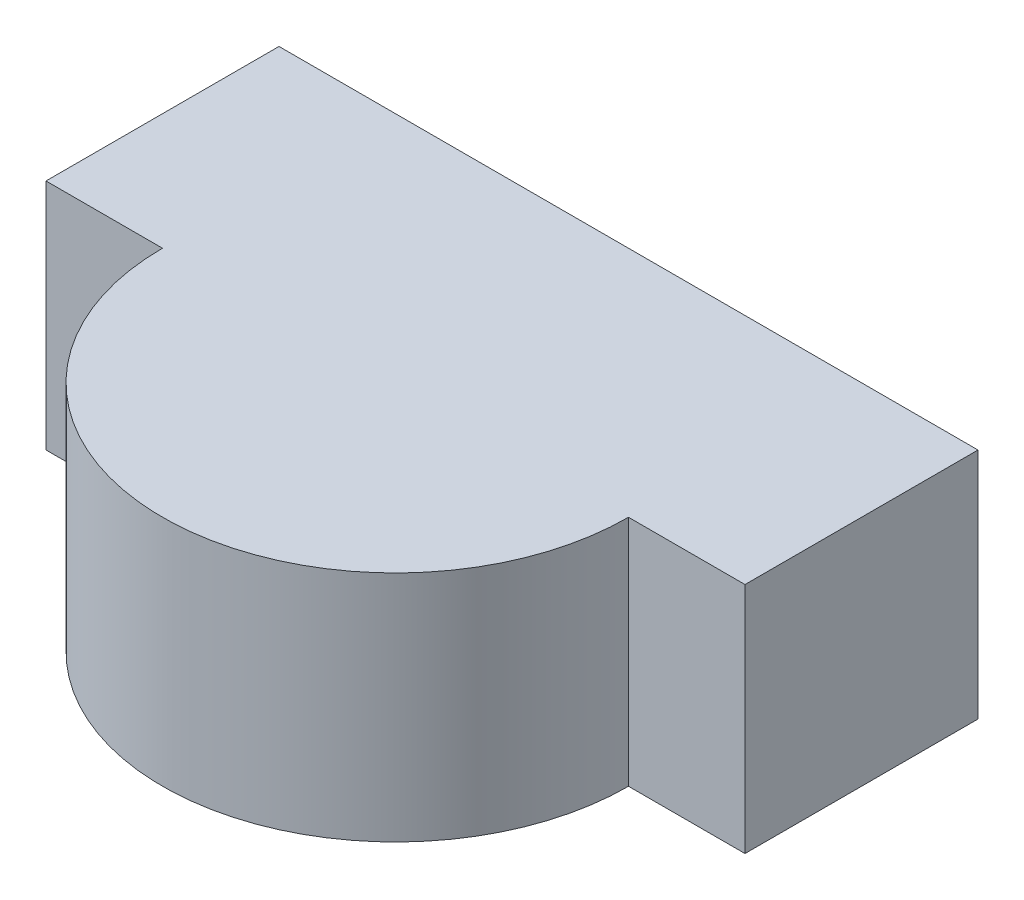
ISO-10303-21;
HEADER;
FILE_DESCRIPTION(('STEP AP214'),'2;1');
FILE_NAME('part.step','',(''),(''),'','','');
FILE_SCHEMA(('AUTOMOTIVE_DESIGN { 1 0 10303 214 1 1 1 1 }'));
ENDSEC;
DATA;
#1=APPLICATION_CONTEXT('core data for automotive mechanical design processes');
#2=APPLICATION_PROTOCOL_DEFINITION('international standard','automotive_design',2000,#1);
#3=PRODUCT_CONTEXT('',#1,'mechanical');
#4=PRODUCT('Part','Part','',(#3));
#5=PRODUCT_RELATED_PRODUCT_CATEGORY('part','',(#4));
#6=PRODUCT_DEFINITION_FORMATION('','',#4);
#7=PRODUCT_DEFINITION_CONTEXT('part definition',#1,'design');
#8=PRODUCT_DEFINITION('design','',#6,#7);
#9=PRODUCT_DEFINITION_SHAPE('','',#8);
#10=(LENGTH_UNIT() NAMED_UNIT(*) SI_UNIT(.MILLI.,.METRE.));
#11=(NAMED_UNIT(*) PLANE_ANGLE_UNIT() SI_UNIT($,.RADIAN.));
#12=(NAMED_UNIT(*) SI_UNIT($,.STERADIAN.) SOLID_ANGLE_UNIT());
#13=UNCERTAINTY_MEASURE_WITH_UNIT(LENGTH_MEASURE(1.E-05),#10,'distance_accuracy_value','');
#14=(GEOMETRIC_REPRESENTATION_CONTEXT(3) GLOBAL_UNCERTAINTY_ASSIGNED_CONTEXT((#13)) GLOBAL_UNIT_ASSIGNED_CONTEXT((#10,
#11,#12)) REPRESENTATION_CONTEXT('',''));
#15=CARTESIAN_POINT('',(0.,0.,0.));
#16=DIRECTION('',(0.,0.,1.));
#17=DIRECTION('',(1.,0.,0.));
#18=AXIS2_PLACEMENT_3D('',#15,#16,#17);
#19=CARTESIAN_POINT('',(1.5,1.,-0.500000000000001));
#20=DIRECTION('',(-1.,0.,0.));
#21=DIRECTION('',(0.,0.,1.));
#22=AXIS2_PLACEMENT_3D('',#19,#20,#21);
#23=PLANE('',#22);
#24=DIRECTION('',(0.,0.,-1.));
#25=VECTOR('',#24,1.);
#26=CARTESIAN_POINT('',(1.5,0.,-0.500000000000001));
#27=LINE('',#26,#25);
#28=CARTESIAN_POINT('',(1.5,0.,0.499999999999999));
#29=VERTEX_POINT('',#28);
#30=CARTESIAN_POINT('',(1.5,0.,-0.500000000000001));
#31=VERTEX_POINT('',#30);
#32=EDGE_CURVE('E116',#29,#31,#27,.T.);
#33=ORIENTED_EDGE('',*,*,#32,.T.);
#34=DIRECTION('',(0.,-1.,0.));
#35=VECTOR('',#34,1.);
#36=CARTESIAN_POINT('',(1.5,1.,-0.500000000000001));
#37=LINE('',#36,#35);
#38=CARTESIAN_POINT('',(1.5,1.,-0.500000000000001));
#39=VERTEX_POINT('',#38);
#40=EDGE_CURVE('E11',#39,#31,#37,.T.);
#41=ORIENTED_EDGE('',*,*,#40,.F.);
#42=DIRECTION('',(0.,0.,-1.));
#43=VECTOR('',#42,1.);
#44=CARTESIAN_POINT('',(1.5,1.,-0.500000000000001));
#45=LINE('',#44,#43);
#46=CARTESIAN_POINT('',(1.5,1.,0.499999999999999));
#47=VERTEX_POINT('',#46);
#48=EDGE_CURVE('E126',#47,#39,#45,.T.);
#49=ORIENTED_EDGE('',*,*,#48,.F.);
#50=DIRECTION('',(0.,-1.,0.));
#51=VECTOR('',#50,1.);
#52=CARTESIAN_POINT('',(1.5,1.,0.499999999999999));
#53=LINE('',#52,#51);
#54=EDGE_CURVE('E112',#47,#29,#53,.T.);
#55=ORIENTED_EDGE('',*,*,#54,.T.);
#56=EDGE_LOOP('',(#33,#41,#49,#55));
#57=FACE_BOUND('',#56,.T.);
#58=ADVANCED_FACE('F32',(#57),#23,.F.);
#59=CARTESIAN_POINT('',(-1.5,1.,-0.500000000000001));
#60=DIRECTION('',(0.,0.,1.));
#61=DIRECTION('',(1.,0.,0.));
#62=AXIS2_PLACEMENT_3D('',#59,#60,#61);
#63=PLANE('',#62);
#64=DIRECTION('',(-1.,0.,0.));
#65=VECTOR('',#64,1.);
#66=CARTESIAN_POINT('',(-1.5,0.,-0.500000000000001));
#67=LINE('',#66,#65);
#68=CARTESIAN_POINT('',(-1.5,0.,-0.500000000000001));
#69=VERTEX_POINT('',#68);
#70=EDGE_CURVE('E119',#31,#69,#67,.T.);
#71=ORIENTED_EDGE('',*,*,#70,.T.);
#72=DIRECTION('',(0.,-1.,0.));
#73=VECTOR('',#72,1.);
#74=CARTESIAN_POINT('',(-1.5,1.,-0.500000000000001));
#75=LINE('',#74,#73);
#76=CARTESIAN_POINT('',(-1.5,1.,-0.500000000000001));
#77=VERTEX_POINT('',#76);
#78=EDGE_CURVE('E40',#77,#69,#75,.T.);
#79=ORIENTED_EDGE('',*,*,#78,.F.);
#80=DIRECTION('',(-1.,0.,0.));
#81=VECTOR('',#80,1.);
#82=CARTESIAN_POINT('',(-1.5,1.,-0.500000000000001));
#83=LINE('',#82,#81);
#84=EDGE_CURVE('E85',#39,#77,#83,.T.);
#85=ORIENTED_EDGE('',*,*,#84,.F.);
#86=ORIENTED_EDGE('',*,*,#40,.T.);
#87=EDGE_LOOP('',(#71,#79,#85,#86));
#88=FACE_BOUND('',#87,.T.);
#89=ADVANCED_FACE('F151',(#88),#63,.F.);
#90=CARTESIAN_POINT('',(-1.5,1.,-0.500000000000001));
#91=DIRECTION('',(1.,0.,0.));
#92=DIRECTION('',(0.,0.,-1.));
#93=AXIS2_PLACEMENT_3D('',#90,#91,#92);
#94=PLANE('',#93);
#95=DIRECTION('',(0.,0.,1.));
#96=VECTOR('',#95,1.);
#97=CARTESIAN_POINT('',(-1.5,0.,-0.500000000000001));
#98=LINE('',#97,#96);
#99=CARTESIAN_POINT('',(-1.5,0.,0.499999999999999));
#100=VERTEX_POINT('',#99);
#101=EDGE_CURVE('E121',#69,#100,#98,.T.);
#102=ORIENTED_EDGE('',*,*,#101,.T.);
#103=DIRECTION('',(0.,-1.,0.));
#104=VECTOR('',#103,1.);
#105=CARTESIAN_POINT('',(-1.5,1.,0.499999999999999));
#106=LINE('',#105,#104);
#107=CARTESIAN_POINT('',(-1.5,1.,0.499999999999999));
#108=VERTEX_POINT('',#107);
#109=EDGE_CURVE('E107',#108,#100,#106,.T.);
#110=ORIENTED_EDGE('',*,*,#109,.F.);
#111=DIRECTION('',(0.,0.,1.));
#112=VECTOR('',#111,1.);
#113=CARTESIAN_POINT('',(-1.5,1.,-0.500000000000001));
#114=LINE('',#113,#112);
#115=EDGE_CURVE('E98',#77,#108,#114,.T.);
#116=ORIENTED_EDGE('',*,*,#115,.F.);
#117=ORIENTED_EDGE('',*,*,#78,.T.);
#118=EDGE_LOOP('',(#102,#110,#116,#117));
#119=FACE_BOUND('',#118,.T.);
#120=ADVANCED_FACE('F132',(#119),#94,.F.);
#121=CARTESIAN_POINT('',(-1.5,1.,0.499999999999999));
#122=DIRECTION('',(0.,0.,-1.));
#123=DIRECTION('',(-1.,0.,0.));
#124=AXIS2_PLACEMENT_3D('',#121,#122,#123);
#125=PLANE('',#124);
#126=DIRECTION('',(1.,0.,0.));
#127=VECTOR('',#126,1.);
#128=CARTESIAN_POINT('',(-1.5,0.,0.499999999999999));
#129=LINE('',#128,#127);
#130=CARTESIAN_POINT('',(-0.999999999999996,0.,0.499999999999999));
#131=VERTEX_POINT('',#130);
#132=EDGE_CURVE('E106',#100,#131,#129,.T.);
#133=ORIENTED_EDGE('',*,*,#132,.T.);
#134=DIRECTION('',(0.,-1.,0.));
#135=VECTOR('',#134,1.);
#136=CARTESIAN_POINT('',(-0.999999999999996,1.,0.499999999999999));
#137=LINE('',#136,#135);
#138=CARTESIAN_POINT('',(-0.999999999999996,1.,0.499999999999999));
#139=VERTEX_POINT('',#138);
#140=EDGE_CURVE('E103',#139,#131,#137,.T.);
#141=ORIENTED_EDGE('',*,*,#140,.F.);
#142=DIRECTION('',(1.,0.,0.));
#143=VECTOR('',#142,1.);
#144=CARTESIAN_POINT('',(-1.5,1.,0.499999999999999));
#145=LINE('',#144,#143);
#146=EDGE_CURVE('E92',#108,#139,#145,.T.);
#147=ORIENTED_EDGE('',*,*,#146,.F.);
#148=ORIENTED_EDGE('',*,*,#109,.T.);
#149=EDGE_LOOP('',(#133,#141,#147,#148));
#150=FACE_BOUND('',#149,.T.);
#151=ADVANCED_FACE('F104',(#150),#125,.F.);
#152=CARTESIAN_POINT('',(0.,1.,0.499999999999999));
#153=DIRECTION('',(0.,-1.,0.));
#154=DIRECTION('',(0.,0.,-1.));
#155=AXIS2_PLACEMENT_3D('',#152,#153,#154);
#156=CYLINDRICAL_SURFACE('',#155,1.);
#157=CARTESIAN_POINT('',(0.,0.,0.499999999999999));
#158=DIRECTION('',(0.,1.,0.));
#159=DIRECTION('',(0.,0.,1.));
#160=AXIS2_PLACEMENT_3D('',#157,#158,#159);
#161=CIRCLE('',#160,1.);
#162=CARTESIAN_POINT('',(1.,0.,0.499999999999999));
#163=VERTEX_POINT('',#162);
#164=EDGE_CURVE('E71',#131,#163,#161,.T.);
#165=ORIENTED_EDGE('',*,*,#164,.T.);
#166=DIRECTION('',(0.,-1.,0.));
#167=VECTOR('',#166,1.);
#168=CARTESIAN_POINT('',(1.,1.,0.499999999999999));
#169=LINE('',#168,#167);
#170=CARTESIAN_POINT('',(1.,1.,0.499999999999999));
#171=VERTEX_POINT('',#170);
#172=EDGE_CURVE('E108',#171,#163,#169,.T.);
#173=ORIENTED_EDGE('',*,*,#172,.F.);
#174=CARTESIAN_POINT('',(0.,1.,0.499999999999999));
#175=DIRECTION('',(0.,1.,0.));
#176=DIRECTION('',(0.,0.,1.));
#177=AXIS2_PLACEMENT_3D('',#174,#175,#176);
#178=CIRCLE('',#177,1.);
#179=EDGE_CURVE('E96',#139,#171,#178,.T.);
#180=ORIENTED_EDGE('',*,*,#179,.F.);
#181=ORIENTED_EDGE('',*,*,#140,.T.);
#182=EDGE_LOOP('',(#165,#173,#180,#181));
#183=FACE_BOUND('',#182,.T.);
#184=ADVANCED_FACE('F110',(#183),#156,.T.);
#185=CARTESIAN_POINT('',(1.,1.,0.499999999999999));
#186=DIRECTION('',(0.,0.,-1.));
#187=DIRECTION('',(-1.,0.,0.));
#188=AXIS2_PLACEMENT_3D('',#185,#186,#187);
#189=PLANE('',#188);
#190=DIRECTION('',(1.,0.,0.));
#191=VECTOR('',#190,1.);
#192=CARTESIAN_POINT('',(1.,0.,0.499999999999999));
#193=LINE('',#192,#191);
#194=EDGE_CURVE('E77',#163,#29,#193,.T.);
#195=ORIENTED_EDGE('',*,*,#194,.T.);
#196=ORIENTED_EDGE('',*,*,#54,.F.);
#197=DIRECTION('',(1.,0.,0.));
#198=VECTOR('',#197,1.);
#199=CARTESIAN_POINT('',(1.,1.,0.499999999999999));
#200=LINE('',#199,#198);
#201=EDGE_CURVE('E48',#171,#47,#200,.T.);
#202=ORIENTED_EDGE('',*,*,#201,.F.);
#203=ORIENTED_EDGE('',*,*,#172,.T.);
#204=EDGE_LOOP('',(#195,#196,#202,#203));
#205=FACE_BOUND('',#204,.T.);
#206=ADVANCED_FACE('F139',(#205),#189,.F.);
#207=CARTESIAN_POINT('',(0.,1.,0.499999999999999));
#208=DIRECTION('',(0.,1.,0.));
#209=DIRECTION('',(0.,0.,1.));
#210=AXIS2_PLACEMENT_3D('',#207,#208,#209);
#211=PLANE('',#210);
#212=ORIENTED_EDGE('',*,*,#48,.T.);
#213=ORIENTED_EDGE('',*,*,#84,.T.);
#214=ORIENTED_EDGE('',*,*,#115,.T.);
#215=ORIENTED_EDGE('',*,*,#146,.T.);
#216=ORIENTED_EDGE('',*,*,#179,.T.);
#217=ORIENTED_EDGE('',*,*,#201,.T.);
#218=EDGE_LOOP('',(#212,#213,#214,#215,#216,#217));
#219=FACE_BOUND('',#218,.T.);
#220=ADVANCED_FACE('F94',(#219),#211,.T.);
#221=CARTESIAN_POINT('',(0.,0.,0.499999999999999));
#222=DIRECTION('',(0.,1.,0.));
#223=DIRECTION('',(0.,0.,1.));
#224=AXIS2_PLACEMENT_3D('',#221,#222,#223);
#225=PLANE('',#224);
#226=ORIENTED_EDGE('',*,*,#32,.F.);
#227=ORIENTED_EDGE('',*,*,#194,.F.);
#228=ORIENTED_EDGE('',*,*,#164,.F.);
#229=ORIENTED_EDGE('',*,*,#132,.F.);
#230=ORIENTED_EDGE('',*,*,#101,.F.);
#231=ORIENTED_EDGE('',*,*,#70,.F.);
#232=EDGE_LOOP('',(#226,#227,#228,#229,#230,#231));
#233=FACE_BOUND('',#232,.T.);
#234=ADVANCED_FACE('F135',(#233),#225,.F.);
#235=CLOSED_SHELL('',(#58,#89,#120,#151,#184,#206,#220,#234));
#236=MANIFOLD_SOLID_BREP('B2',#235);
#237=ADVANCED_BREP_SHAPE_REPRESENTATION('',(#18,#236),#14);
#238=SHAPE_DEFINITION_REPRESENTATION(#9,#237);
ENDSEC;
END-ISO-10303-21;
